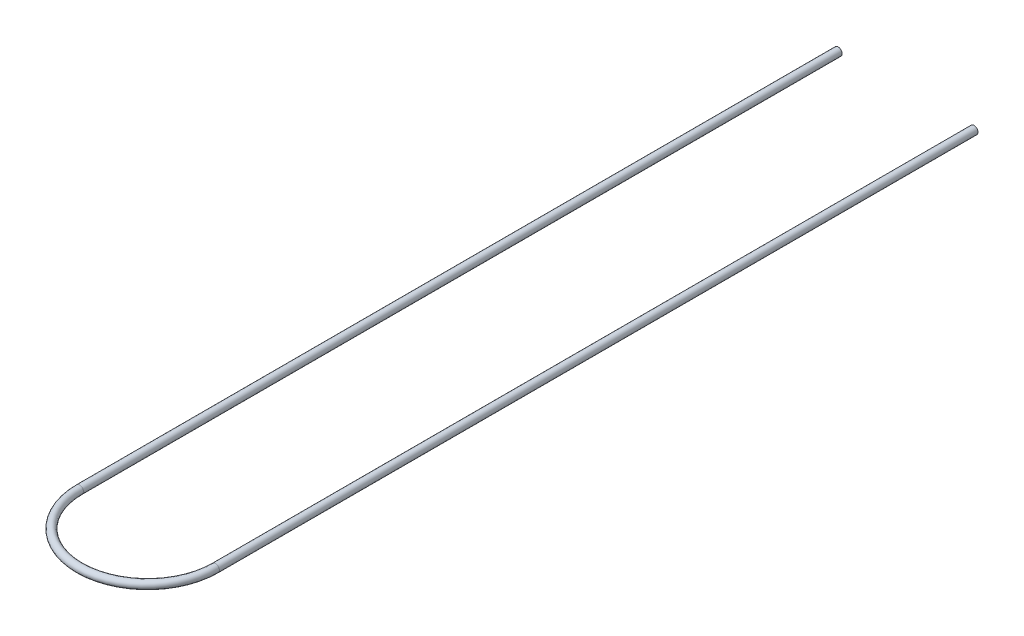
ISO-10303-21;
HEADER;
FILE_DESCRIPTION(('STEP AP214'),'2;1');
FILE_NAME('part.step','',(''),(''),'','','');
FILE_SCHEMA(('AUTOMOTIVE_DESIGN { 1 0 10303 214 1 1 1 1 }'));
ENDSEC;
DATA;
#1=APPLICATION_CONTEXT('core data for automotive mechanical design processes');
#2=APPLICATION_PROTOCOL_DEFINITION('international standard','automotive_design',2000,#1);
#3=PRODUCT_CONTEXT('',#1,'mechanical');
#4=PRODUCT('Part','Part','',(#3));
#5=PRODUCT_RELATED_PRODUCT_CATEGORY('part','',(#4));
#6=PRODUCT_DEFINITION_FORMATION('','',#4);
#7=PRODUCT_DEFINITION_CONTEXT('part definition',#1,'design');
#8=PRODUCT_DEFINITION('design','',#6,#7);
#9=PRODUCT_DEFINITION_SHAPE('','',#8);
#10=(LENGTH_UNIT() NAMED_UNIT(*) SI_UNIT(.MILLI.,.METRE.));
#11=(NAMED_UNIT(*) PLANE_ANGLE_UNIT() SI_UNIT($,.RADIAN.));
#12=(NAMED_UNIT(*) SI_UNIT($,.STERADIAN.) SOLID_ANGLE_UNIT());
#13=UNCERTAINTY_MEASURE_WITH_UNIT(LENGTH_MEASURE(1.E-05),#10,'distance_accuracy_value','');
#14=(GEOMETRIC_REPRESENTATION_CONTEXT(3) GLOBAL_UNCERTAINTY_ASSIGNED_CONTEXT((#13)) GLOBAL_UNIT_ASSIGNED_CONTEXT((#10,
#11,#12)) REPRESENTATION_CONTEXT('',''));
#15=CARTESIAN_POINT('',(0.,0.,0.));
#16=DIRECTION('',(0.,0.,1.));
#17=DIRECTION('',(1.,0.,0.));
#18=AXIS2_PLACEMENT_3D('',#15,#16,#17);
#19=CARTESIAN_POINT('',(-40.,0.,299.999999999999));
#20=DIRECTION('',(0.,0.,1.));
#21=DIRECTION('',(1.,0.,0.));
#22=AXIS2_PLACEMENT_3D('',#19,#20,#21);
#23=CYLINDRICAL_SURFACE('',#22,11.1);
#24=CARTESIAN_POINT('',(-39.9999999999997,0.,2440.));
#25=DIRECTION('',(0.,0.,1.));
#26=DIRECTION('',(1.,0.,0.));
#27=AXIS2_PLACEMENT_3D('',#24,#25,#26);
#28=CIRCLE('',#27,11.1);
#29=CARTESIAN_POINT('',(-51.0999999999997,0.,2440.));
#30=VERTEX_POINT('',#29);
#31=EDGE_CURVE('E54',#30,#30,#28,.T.);
#32=ORIENTED_EDGE('',*,*,#31,.F.);
#33=EDGE_LOOP('',(#32));
#34=FACE_BOUND('',#33,.T.);
#35=CARTESIAN_POINT('',(-40.,0.,299.999999999999));
#36=DIRECTION('',(0.,0.,1.));
#37=DIRECTION('',(1.,0.,0.));
#38=AXIS2_PLACEMENT_3D('',#35,#36,#37);
#39=CIRCLE('',#38,11.1);
#40=CARTESIAN_POINT('',(-28.9,0.,299.999999999999));
#41=VERTEX_POINT('',#40);
#42=EDGE_CURVE('E52',#41,#41,#39,.T.);
#43=ORIENTED_EDGE('',*,*,#42,.T.);
#44=EDGE_LOOP('',(#43));
#45=FACE_BOUND('',#44,.T.);
#46=ADVANCED_FACE('F31',(#34,#45),#23,.T.);
#47=CARTESIAN_POINT('',(151.695,0.,2440.));
#48=DIRECTION('',(0.,1.,0.));
#49=DIRECTION('',(0.,0.,1.));
#50=AXIS2_PLACEMENT_3D('',#47,#48,#49);
#51=TOROIDAL_SURFACE('',#50,191.695,11.1);
#52=CARTESIAN_POINT('',(343.39,0.,2440.));
#53=DIRECTION('',(0.,0.,-1.));
#54=DIRECTION('',(-1.,0.,0.));
#55=AXIS2_PLACEMENT_3D('',#52,#53,#54);
#56=CIRCLE('',#55,11.1);
#57=CARTESIAN_POINT('',(354.49,0.,2440.));
#58=VERTEX_POINT('',#57);
#59=EDGE_CURVE('E35',#58,#58,#56,.T.);
#60=CARTESIAN_POINT('',(151.695,0.,2440.));
#61=DIRECTION('',(0.,1.,0.));
#62=DIRECTION('',(0.,0.,1.));
#63=AXIS2_PLACEMENT_3D('',#60,#61,#62);
#64=CIRCLE('',#63,202.795);
#65=EDGE_CURVE('',#30,#58,#64,.T.);
#66=ORIENTED_EDGE('',*,*,#31,.T.);
#67=ORIENTED_EDGE('',*,*,#59,.F.);
#68=ORIENTED_EDGE('',*,*,#65,.T.);
#69=ORIENTED_EDGE('',*,*,#65,.F.);
#70=EDGE_LOOP('',(#66,#68,#67,#69));
#71=FACE_BOUND('',#70,.T.);
#72=ADVANCED_FACE('F62',(#71),#51,.T.);
#73=CARTESIAN_POINT('',(343.39,0.,2440.));
#74=DIRECTION('',(0.,0.,-1.));
#75=DIRECTION('',(-1.,0.,0.));
#76=AXIS2_PLACEMENT_3D('',#73,#74,#75);
#77=CYLINDRICAL_SURFACE('',#76,11.1);
#78=CARTESIAN_POINT('',(343.39,0.,299.999999999999));
#79=DIRECTION('',(0.,0.,-1.));
#80=DIRECTION('',(-1.,0.,0.));
#81=AXIS2_PLACEMENT_3D('',#78,#79,#80);
#82=CIRCLE('',#81,11.1);
#83=CARTESIAN_POINT('',(332.29,0.,299.999999999999));
#84=VERTEX_POINT('',#83);
#85=EDGE_CURVE('E48',#84,#84,#82,.T.);
#86=ORIENTED_EDGE('',*,*,#85,.F.);
#87=EDGE_LOOP('',(#86));
#88=FACE_BOUND('',#87,.T.);
#89=ORIENTED_EDGE('',*,*,#59,.T.);
#90=EDGE_LOOP('',(#89));
#91=FACE_BOUND('',#90,.T.);
#92=ADVANCED_FACE('F33',(#88,#91),#77,.T.);
#93=CARTESIAN_POINT('',(-40.,0.,299.999999999999));
#94=DIRECTION('',(0.,0.,1.));
#95=DIRECTION('',(1.,0.,0.));
#96=AXIS2_PLACEMENT_3D('',#93,#94,#95);
#97=PLANE('',#96);
#98=CARTESIAN_POINT('',(-40.,0.,299.999999999999));
#99=DIRECTION('',(0.,0.,1.));
#100=DIRECTION('',(1.,0.,0.));
#101=AXIS2_PLACEMENT_3D('',#98,#99,#100);
#102=CIRCLE('',#101,9.95000000000001);
#103=CARTESIAN_POINT('',(-30.05,0.,299.999999999999));
#104=VERTEX_POINT('',#103);
#105=EDGE_CURVE('E51',#104,#104,#102,.F.);
#106=ORIENTED_EDGE('',*,*,#105,.F.);
#107=EDGE_LOOP('',(#106));
#108=FACE_BOUND('',#107,.T.);
#109=ORIENTED_EDGE('',*,*,#42,.F.);
#110=EDGE_LOOP('',(#109));
#111=FACE_BOUND('',#110,.T.);
#112=ADVANCED_FACE('F68',(#108,#111),#97,.F.);
#113=CARTESIAN_POINT('',(343.39,0.,299.999999999999));
#114=DIRECTION('',(0.,0.,-1.));
#115=DIRECTION('',(-1.,0.,0.));
#116=AXIS2_PLACEMENT_3D('',#113,#114,#115);
#117=PLANE('',#116);
#118=CARTESIAN_POINT('',(343.39,0.,299.999999999999));
#119=DIRECTION('',(0.,0.,-1.));
#120=DIRECTION('',(-1.,0.,0.));
#121=AXIS2_PLACEMENT_3D('',#118,#119,#120);
#122=CIRCLE('',#121,9.95000000000001);
#123=CARTESIAN_POINT('',(333.44,0.,299.999999999999));
#124=VERTEX_POINT('',#123);
#125=EDGE_CURVE('E10',#124,#124,#122,.F.);
#126=ORIENTED_EDGE('',*,*,#125,.T.);
#127=EDGE_LOOP('',(#126));
#128=FACE_BOUND('',#127,.T.);
#129=ORIENTED_EDGE('',*,*,#85,.T.);
#130=EDGE_LOOP('',(#129));
#131=FACE_BOUND('',#130,.T.);
#132=ADVANCED_FACE('F86',(#128,#131),#117,.T.);
#133=CARTESIAN_POINT('',(-40.,0.,299.999999999999));
#134=DIRECTION('',(0.,0.,1.));
#135=DIRECTION('',(1.,0.,0.));
#136=AXIS2_PLACEMENT_3D('',#133,#134,#135);
#137=CYLINDRICAL_SURFACE('',#136,9.95000000000001);
#138=CARTESIAN_POINT('',(-39.9999999999997,0.,2440.));
#139=DIRECTION('',(0.,0.,1.));
#140=DIRECTION('',(1.,0.,0.));
#141=AXIS2_PLACEMENT_3D('',#138,#139,#140);
#142=CIRCLE('',#141,9.95000000000001);
#143=CARTESIAN_POINT('',(-49.9499999999997,0.,2440.));
#144=VERTEX_POINT('',#143);
#145=EDGE_CURVE('E44',#144,#144,#142,.F.);
#146=ORIENTED_EDGE('',*,*,#145,.F.);
#147=EDGE_LOOP('',(#146));
#148=FACE_BOUND('',#147,.T.);
#149=ORIENTED_EDGE('',*,*,#105,.T.);
#150=EDGE_LOOP('',(#149));
#151=FACE_BOUND('',#150,.T.);
#152=ADVANCED_FACE('F80',(#148,#151),#137,.F.);
#153=CARTESIAN_POINT('',(151.695,0.,2440.));
#154=DIRECTION('',(0.,1.,0.));
#155=DIRECTION('',(0.,0.,1.));
#156=AXIS2_PLACEMENT_3D('',#153,#154,#155);
#157=TOROIDAL_SURFACE('',#156,191.695,9.95000000000001);
#158=CARTESIAN_POINT('',(343.39,0.,2440.));
#159=DIRECTION('',(0.,0.,-1.));
#160=DIRECTION('',(-1.,0.,0.));
#161=AXIS2_PLACEMENT_3D('',#158,#159,#160);
#162=CIRCLE('',#161,9.95000000000001);
#163=CARTESIAN_POINT('',(353.34,0.,2440.));
#164=VERTEX_POINT('',#163);
#165=EDGE_CURVE('E39',#164,#164,#162,.F.);
#166=CARTESIAN_POINT('',(151.695,0.,2440.));
#167=DIRECTION('',(0.,1.,0.));
#168=DIRECTION('',(0.,0.,1.));
#169=AXIS2_PLACEMENT_3D('',#166,#167,#168);
#170=CIRCLE('',#169,201.645);
#171=EDGE_CURVE('',#144,#164,#170,.T.);
#172=ORIENTED_EDGE('',*,*,#145,.T.);
#173=ORIENTED_EDGE('',*,*,#165,.F.);
#174=ORIENTED_EDGE('',*,*,#171,.T.);
#175=ORIENTED_EDGE('',*,*,#171,.F.);
#176=EDGE_LOOP('',(#172,#174,#173,#175));
#177=FACE_BOUND('',#176,.T.);
#178=ADVANCED_FACE('F74',(#177),#157,.F.);
#179=CARTESIAN_POINT('',(343.39,0.,2440.));
#180=DIRECTION('',(0.,0.,-1.));
#181=DIRECTION('',(-1.,0.,0.));
#182=AXIS2_PLACEMENT_3D('',#179,#180,#181);
#183=CYLINDRICAL_SURFACE('',#182,9.95000000000001);
#184=ORIENTED_EDGE('',*,*,#125,.F.);
#185=EDGE_LOOP('',(#184));
#186=FACE_BOUND('',#185,.T.);
#187=ORIENTED_EDGE('',*,*,#165,.T.);
#188=EDGE_LOOP('',(#187));
#189=FACE_BOUND('',#188,.T.);
#190=ADVANCED_FACE('F72',(#186,#189),#183,.F.);
#191=CLOSED_SHELL('',(#46,#72,#92,#112,#132,#152,#178,#190));
#192=MANIFOLD_SOLID_BREP('B2',#191);
#193=ADVANCED_BREP_SHAPE_REPRESENTATION('',(#18,#192),#14);
#194=SHAPE_DEFINITION_REPRESENTATION(#9,#193);
ENDSEC;
END-ISO-10303-21;
